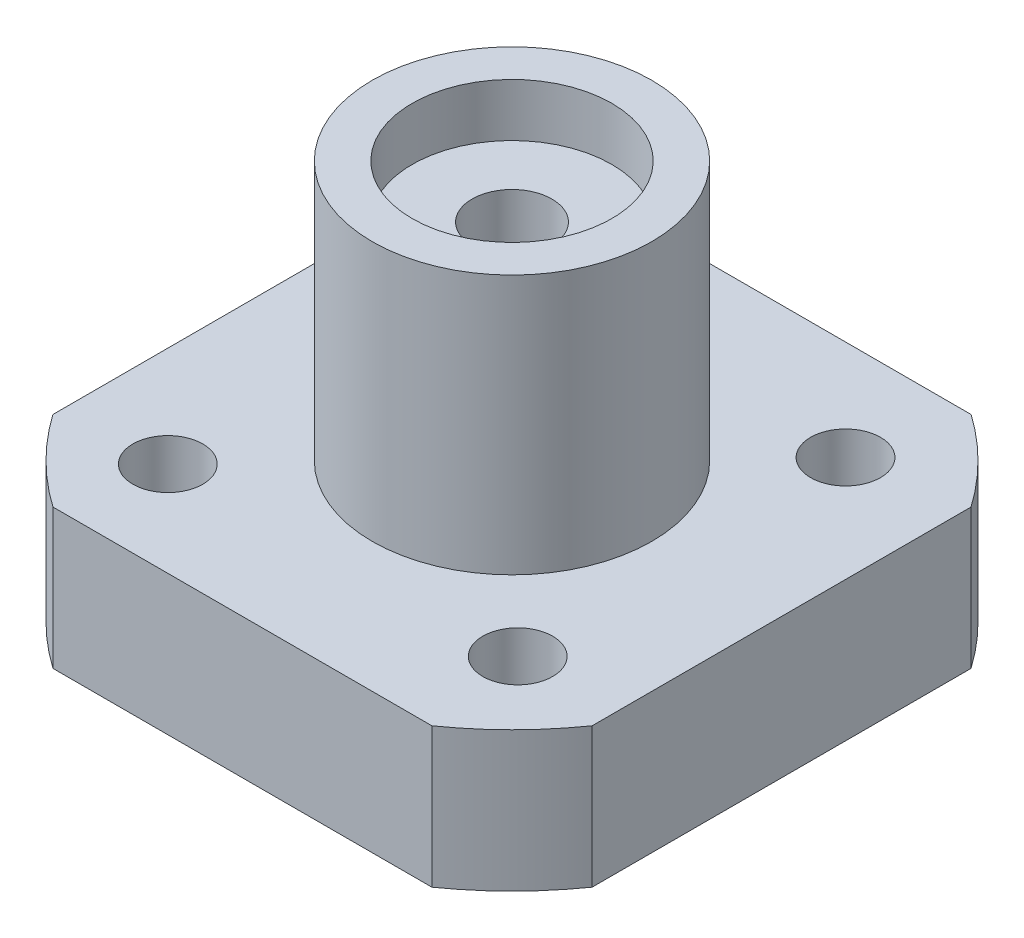
ISO-10303-21;
HEADER;
FILE_DESCRIPTION(('STEP AP214'),'2;1');
FILE_NAME('part.step','',(''),(''),'','','');
FILE_SCHEMA(('AUTOMOTIVE_DESIGN { 1 0 10303 214 1 1 1 1 }'));
ENDSEC;
DATA;
#1=APPLICATION_CONTEXT('core data for automotive mechanical design processes');
#2=APPLICATION_PROTOCOL_DEFINITION('international standard','automotive_design',2000,#1);
#3=PRODUCT_CONTEXT('',#1,'mechanical');
#4=PRODUCT('Part','Part','',(#3));
#5=PRODUCT_RELATED_PRODUCT_CATEGORY('part','',(#4));
#6=PRODUCT_DEFINITION_FORMATION('','',#4);
#7=PRODUCT_DEFINITION_CONTEXT('part definition',#1,'design');
#8=PRODUCT_DEFINITION('design','',#6,#7);
#9=PRODUCT_DEFINITION_SHAPE('','',#8);
#10=(LENGTH_UNIT() NAMED_UNIT(*) SI_UNIT(.MILLI.,.METRE.));
#11=(NAMED_UNIT(*) PLANE_ANGLE_UNIT() SI_UNIT($,.RADIAN.));
#12=(NAMED_UNIT(*) SI_UNIT($,.STERADIAN.) SOLID_ANGLE_UNIT());
#13=UNCERTAINTY_MEASURE_WITH_UNIT(LENGTH_MEASURE(1.E-05),#10,'distance_accuracy_value','');
#14=(GEOMETRIC_REPRESENTATION_CONTEXT(3) GLOBAL_UNCERTAINTY_ASSIGNED_CONTEXT((#13)) GLOBAL_UNIT_ASSIGNED_CONTEXT((#10,
#11,#12)) REPRESENTATION_CONTEXT('',''));
#15=CARTESIAN_POINT('',(0.,0.,0.));
#16=DIRECTION('',(0.,0.,1.));
#17=DIRECTION('',(1.,0.,0.));
#18=AXIS2_PLACEMENT_3D('',#15,#16,#17);
#19=CARTESIAN_POINT('',(0.,-10.,0.));
#20=DIRECTION('',(0.,1.,0.));
#21=DIRECTION('',(0.,0.,1.));
#22=AXIS2_PLACEMENT_3D('',#19,#20,#21);
#23=CYLINDRICAL_SURFACE('',#22,2.);
#24=CARTESIAN_POINT('',(0.,17.35,0.));
#25=DIRECTION('',(0.,1.,0.));
#26=DIRECTION('',(0.,0.,1.));
#27=AXIS2_PLACEMENT_3D('',#24,#25,#26);
#28=CIRCLE('',#27,2.);
#29=CARTESIAN_POINT('',(0.,17.35,2.));
#30=VERTEX_POINT('',#29);
#31=EDGE_CURVE('E168',#30,#30,#28,.F.);
#32=ORIENTED_EDGE('',*,*,#31,.F.);
#33=EDGE_LOOP('',(#32));
#34=FACE_BOUND('',#33,.T.);
#35=CARTESIAN_POINT('',(0.,2.65,0.));
#36=DIRECTION('',(0.,-1.,0.));
#37=DIRECTION('',(0.,0.,-1.));
#38=AXIS2_PLACEMENT_3D('',#35,#36,#37);
#39=CIRCLE('',#38,2.);
#40=CARTESIAN_POINT('',(0.,2.65,-2.));
#41=VERTEX_POINT('',#40);
#42=EDGE_CURVE('E172',#41,#41,#39,.F.);
#43=ORIENTED_EDGE('',*,*,#42,.F.);
#44=EDGE_LOOP('',(#43));
#45=FACE_BOUND('',#44,.T.);
#46=ADVANCED_FACE('F39',(#34,#45),#23,.F.);
#47=CARTESIAN_POINT('',(0.,7.,0.));
#48=DIRECTION('',(0.,-1.,0.));
#49=DIRECTION('',(0.,0.,-1.));
#50=AXIS2_PLACEMENT_3D('',#47,#48,#49);
#51=CYLINDRICAL_SURFACE('',#50,16.5);
#52=CARTESIAN_POINT('',(0.,0.,0.));
#53=DIRECTION('',(0.,1.,0.));
#54=DIRECTION('',(0.,0.,1.));
#55=AXIS2_PLACEMENT_3D('',#52,#53,#54);
#56=CIRCLE('',#55,16.5);
#57=CARTESIAN_POINT('',(13.5,0.,-9.48683298050515));
#58=VERTEX_POINT('',#57);
#59=CARTESIAN_POINT('',(9.48683298050514,0.,-13.5));
#60=VERTEX_POINT('',#59);
#61=EDGE_CURVE('E139',#58,#60,#56,.T.);
#62=ORIENTED_EDGE('',*,*,#61,.T.);
#63=DIRECTION('',(0.,-1.,0.));
#64=VECTOR('',#63,1.);
#65=CARTESIAN_POINT('',(9.48683298050514,7.,-13.5));
#66=LINE('',#65,#64);
#67=CARTESIAN_POINT('',(9.48683298050514,7.,-13.5));
#68=VERTEX_POINT('',#67);
#69=EDGE_CURVE('E49',#68,#60,#66,.T.);
#70=ORIENTED_EDGE('',*,*,#69,.F.);
#71=CARTESIAN_POINT('',(0.,7.,0.));
#72=DIRECTION('',(0.,1.,0.));
#73=DIRECTION('',(0.,0.,1.));
#74=AXIS2_PLACEMENT_3D('',#71,#72,#73);
#75=CIRCLE('',#74,16.5);
#76=CARTESIAN_POINT('',(13.5,7.,-9.48683298050515));
#77=VERTEX_POINT('',#76);
#78=EDGE_CURVE('E154',#77,#68,#75,.T.);
#79=ORIENTED_EDGE('',*,*,#78,.F.);
#80=DIRECTION('',(0.,-1.,0.));
#81=VECTOR('',#80,1.);
#82=CARTESIAN_POINT('',(13.5,7.,-9.48683298050515));
#83=LINE('',#82,#81);
#84=EDGE_CURVE('E135',#77,#58,#83,.T.);
#85=ORIENTED_EDGE('',*,*,#84,.T.);
#86=EDGE_LOOP('',(#62,#70,#79,#85));
#87=FACE_BOUND('',#86,.T.);
#88=ADVANCED_FACE('F41',(#87),#51,.T.);
#89=CARTESIAN_POINT('',(9.48683298050514,7.,-13.5));
#90=DIRECTION('',(0.,0.,1.));
#91=DIRECTION('',(1.,0.,0.));
#92=AXIS2_PLACEMENT_3D('',#89,#90,#91);
#93=PLANE('',#92);
#94=DIRECTION('',(-1.,0.,0.));
#95=VECTOR('',#94,1.);
#96=CARTESIAN_POINT('',(9.48683298050514,0.,-13.5));
#97=LINE('',#96,#95);
#98=CARTESIAN_POINT('',(-9.48683298050514,0.,-13.5));
#99=VERTEX_POINT('',#98);
#100=EDGE_CURVE('E142',#60,#99,#97,.T.);
#101=ORIENTED_EDGE('',*,*,#100,.T.);
#102=DIRECTION('',(0.,-1.,0.));
#103=VECTOR('',#102,1.);
#104=CARTESIAN_POINT('',(-9.48683298050514,7.,-13.5));
#105=LINE('',#104,#103);
#106=CARTESIAN_POINT('',(-9.48683298050514,7.,-13.5));
#107=VERTEX_POINT('',#106);
#108=EDGE_CURVE('E164',#107,#99,#105,.T.);
#109=ORIENTED_EDGE('',*,*,#108,.F.);
#110=DIRECTION('',(-1.,0.,0.));
#111=VECTOR('',#110,1.);
#112=CARTESIAN_POINT('',(9.48683298050514,7.,-13.5));
#113=LINE('',#112,#111);
#114=EDGE_CURVE('E102',#68,#107,#113,.T.);
#115=ORIENTED_EDGE('',*,*,#114,.F.);
#116=ORIENTED_EDGE('',*,*,#69,.T.);
#117=EDGE_LOOP('',(#101,#109,#115,#116));
#118=FACE_BOUND('',#117,.T.);
#119=ADVANCED_FACE('F265',(#118),#93,.F.);
#120=CARTESIAN_POINT('',(0.,7.,0.));
#121=DIRECTION('',(0.,-1.,0.));
#122=DIRECTION('',(0.,0.,-1.));
#123=AXIS2_PLACEMENT_3D('',#120,#121,#122);
#124=CYLINDRICAL_SURFACE('',#123,16.5);
#125=CARTESIAN_POINT('',(0.,0.,0.));
#126=DIRECTION('',(0.,1.,0.));
#127=DIRECTION('',(0.,0.,1.));
#128=AXIS2_PLACEMENT_3D('',#125,#126,#127);
#129=CIRCLE('',#128,16.5);
#130=CARTESIAN_POINT('',(-13.5,0.,-9.48683298050514));
#131=VERTEX_POINT('',#130);
#132=EDGE_CURVE('E145',#99,#131,#129,.T.);
#133=ORIENTED_EDGE('',*,*,#132,.T.);
#134=DIRECTION('',(0.,-1.,0.));
#135=VECTOR('',#134,1.);
#136=CARTESIAN_POINT('',(-13.5,7.,-9.48683298050514));
#137=LINE('',#136,#135);
#138=CARTESIAN_POINT('',(-13.5,7.,-9.48683298050514));
#139=VERTEX_POINT('',#138);
#140=EDGE_CURVE('E161',#139,#131,#137,.T.);
#141=ORIENTED_EDGE('',*,*,#140,.F.);
#142=CARTESIAN_POINT('',(0.,7.,0.));
#143=DIRECTION('',(0.,1.,0.));
#144=DIRECTION('',(0.,0.,1.));
#145=AXIS2_PLACEMENT_3D('',#142,#143,#144);
#146=CIRCLE('',#145,16.5);
#147=EDGE_CURVE('E228',#107,#139,#146,.T.);
#148=ORIENTED_EDGE('',*,*,#147,.F.);
#149=ORIENTED_EDGE('',*,*,#108,.T.);
#150=EDGE_LOOP('',(#133,#141,#148,#149));
#151=FACE_BOUND('',#150,.T.);
#152=ADVANCED_FACE('F557',(#151),#124,.T.);
#153=CARTESIAN_POINT('',(-13.5,7.,9.48683298050514));
#154=DIRECTION('',(1.,0.,0.));
#155=DIRECTION('',(0.,0.,-1.));
#156=AXIS2_PLACEMENT_3D('',#153,#154,#155);
#157=PLANE('',#156);
#158=DIRECTION('',(0.,0.,1.));
#159=VECTOR('',#158,1.);
#160=CARTESIAN_POINT('',(-13.5,0.,9.48683298050514));
#161=LINE('',#160,#159);
#162=CARTESIAN_POINT('',(-13.5,0.,9.48683298050514));
#163=VERTEX_POINT('',#162);
#164=EDGE_CURVE('E147',#131,#163,#161,.T.);
#165=ORIENTED_EDGE('',*,*,#164,.T.);
#166=DIRECTION('',(0.,-1.,0.));
#167=VECTOR('',#166,1.);
#168=CARTESIAN_POINT('',(-13.5,7.,9.48683298050514));
#169=LINE('',#168,#167);
#170=CARTESIAN_POINT('',(-13.5,7.,9.48683298050514));
#171=VERTEX_POINT('',#170);
#172=EDGE_CURVE('E158',#171,#163,#169,.T.);
#173=ORIENTED_EDGE('',*,*,#172,.F.);
#174=DIRECTION('',(0.,0.,1.));
#175=VECTOR('',#174,1.);
#176=CARTESIAN_POINT('',(-13.5,7.,9.48683298050514));
#177=LINE('',#176,#175);
#178=EDGE_CURVE('E230',#139,#171,#177,.T.);
#179=ORIENTED_EDGE('',*,*,#178,.F.);
#180=ORIENTED_EDGE('',*,*,#140,.T.);
#181=EDGE_LOOP('',(#165,#173,#179,#180));
#182=FACE_BOUND('',#181,.T.);
#183=ADVANCED_FACE('F236',(#182),#157,.F.);
#184=CARTESIAN_POINT('',(0.,7.,0.));
#185=DIRECTION('',(0.,-1.,0.));
#186=DIRECTION('',(0.,0.,-1.));
#187=AXIS2_PLACEMENT_3D('',#184,#185,#186);
#188=CYLINDRICAL_SURFACE('',#187,16.5);
#189=CARTESIAN_POINT('',(0.,0.,0.));
#190=DIRECTION('',(0.,1.,0.));
#191=DIRECTION('',(0.,0.,1.));
#192=AXIS2_PLACEMENT_3D('',#189,#190,#191);
#193=CIRCLE('',#192,16.5);
#194=CARTESIAN_POINT('',(-9.48683298050515,0.,13.5));
#195=VERTEX_POINT('',#194);
#196=EDGE_CURVE('E149',#163,#195,#193,.T.);
#197=ORIENTED_EDGE('',*,*,#196,.T.);
#198=DIRECTION('',(0.,-1.,0.));
#199=VECTOR('',#198,1.);
#200=CARTESIAN_POINT('',(-9.48683298050515,7.,13.5));
#201=LINE('',#200,#199);
#202=CARTESIAN_POINT('',(-9.48683298050515,7.,13.5));
#203=VERTEX_POINT('',#202);
#204=EDGE_CURVE('E130',#203,#195,#201,.T.);
#205=ORIENTED_EDGE('',*,*,#204,.F.);
#206=CARTESIAN_POINT('',(0.,7.,0.));
#207=DIRECTION('',(0.,1.,0.));
#208=DIRECTION('',(0.,0.,1.));
#209=AXIS2_PLACEMENT_3D('',#206,#207,#208);
#210=CIRCLE('',#209,16.5);
#211=EDGE_CURVE('E121',#171,#203,#210,.T.);
#212=ORIENTED_EDGE('',*,*,#211,.F.);
#213=ORIENTED_EDGE('',*,*,#172,.T.);
#214=EDGE_LOOP('',(#197,#205,#212,#213));
#215=FACE_BOUND('',#214,.T.);
#216=ADVANCED_FACE('F240',(#215),#188,.T.);
#217=CARTESIAN_POINT('',(9.48683298050515,7.,13.5));
#218=DIRECTION('',(0.,0.,-1.));
#219=DIRECTION('',(-1.,0.,0.));
#220=AXIS2_PLACEMENT_3D('',#217,#218,#219);
#221=PLANE('',#220);
#222=DIRECTION('',(1.,0.,0.));
#223=VECTOR('',#222,1.);
#224=CARTESIAN_POINT('',(9.48683298050515,0.,13.5));
#225=LINE('',#224,#223);
#226=CARTESIAN_POINT('',(9.48683298050515,0.,13.5));
#227=VERTEX_POINT('',#226);
#228=EDGE_CURVE('E129',#195,#227,#225,.T.);
#229=ORIENTED_EDGE('',*,*,#228,.T.);
#230=DIRECTION('',(0.,-1.,0.));
#231=VECTOR('',#230,1.);
#232=CARTESIAN_POINT('',(9.48683298050515,7.,13.5));
#233=LINE('',#232,#231);
#234=CARTESIAN_POINT('',(9.48683298050515,7.,13.5));
#235=VERTEX_POINT('',#234);
#236=EDGE_CURVE('E126',#235,#227,#233,.T.);
#237=ORIENTED_EDGE('',*,*,#236,.F.);
#238=DIRECTION('',(1.,0.,0.));
#239=VECTOR('',#238,1.);
#240=CARTESIAN_POINT('',(9.48683298050515,7.,13.5));
#241=LINE('',#240,#239);
#242=EDGE_CURVE('E115',#203,#235,#241,.T.);
#243=ORIENTED_EDGE('',*,*,#242,.F.);
#244=ORIENTED_EDGE('',*,*,#204,.T.);
#245=EDGE_LOOP('',(#229,#237,#243,#244));
#246=FACE_BOUND('',#245,.T.);
#247=ADVANCED_FACE('F127',(#246),#221,.F.);
#248=CARTESIAN_POINT('',(0.,7.,0.));
#249=DIRECTION('',(0.,-1.,0.));
#250=DIRECTION('',(0.,0.,-1.));
#251=AXIS2_PLACEMENT_3D('',#248,#249,#250);
#252=CYLINDRICAL_SURFACE('',#251,16.5);
#253=CARTESIAN_POINT('',(0.,0.,0.));
#254=DIRECTION('',(0.,1.,0.));
#255=DIRECTION('',(0.,0.,1.));
#256=AXIS2_PLACEMENT_3D('',#253,#254,#255);
#257=CIRCLE('',#256,16.5);
#258=CARTESIAN_POINT('',(13.5,0.,9.48683298050515));
#259=VERTEX_POINT('',#258);
#260=EDGE_CURVE('E87',#227,#259,#257,.T.);
#261=ORIENTED_EDGE('',*,*,#260,.T.);
#262=DIRECTION('',(0.,-1.,0.));
#263=VECTOR('',#262,1.);
#264=CARTESIAN_POINT('',(13.5,7.,9.48683298050515));
#265=LINE('',#264,#263);
#266=CARTESIAN_POINT('',(13.5,7.,9.48683298050515));
#267=VERTEX_POINT('',#266);
#268=EDGE_CURVE('E131',#267,#259,#265,.T.);
#269=ORIENTED_EDGE('',*,*,#268,.F.);
#270=CARTESIAN_POINT('',(0.,7.,0.));
#271=DIRECTION('',(0.,1.,0.));
#272=DIRECTION('',(0.,0.,1.));
#273=AXIS2_PLACEMENT_3D('',#270,#271,#272);
#274=CIRCLE('',#273,16.5);
#275=EDGE_CURVE('E119',#235,#267,#274,.T.);
#276=ORIENTED_EDGE('',*,*,#275,.F.);
#277=ORIENTED_EDGE('',*,*,#236,.T.);
#278=EDGE_LOOP('',(#261,#269,#276,#277));
#279=FACE_BOUND('',#278,.T.);
#280=ADVANCED_FACE('F133',(#279),#252,.T.);
#281=CARTESIAN_POINT('',(13.5,7.,9.48683298050515));
#282=DIRECTION('',(-1.,0.,0.));
#283=DIRECTION('',(0.,0.,1.));
#284=AXIS2_PLACEMENT_3D('',#281,#282,#283);
#285=PLANE('',#284);
#286=DIRECTION('',(0.,0.,-1.));
#287=VECTOR('',#286,1.);
#288=CARTESIAN_POINT('',(13.5,0.,9.48683298050515));
#289=LINE('',#288,#287);
#290=EDGE_CURVE('E93',#259,#58,#289,.T.);
#291=ORIENTED_EDGE('',*,*,#290,.T.);
#292=ORIENTED_EDGE('',*,*,#84,.F.);
#293=DIRECTION('',(0.,0.,-1.));
#294=VECTOR('',#293,1.);
#295=CARTESIAN_POINT('',(13.5,7.,9.48683298050515));
#296=LINE('',#295,#294);
#297=EDGE_CURVE('E58',#267,#77,#296,.T.);
#298=ORIENTED_EDGE('',*,*,#297,.F.);
#299=ORIENTED_EDGE('',*,*,#268,.T.);
#300=EDGE_LOOP('',(#291,#292,#298,#299));
#301=FACE_BOUND('',#300,.T.);
#302=ADVANCED_FACE('F248',(#301),#285,.F.);
#303=CARTESIAN_POINT('',(0.,7.,0.));
#304=DIRECTION('',(0.,1.,0.));
#305=DIRECTION('',(0.,0.,1.));
#306=AXIS2_PLACEMENT_3D('',#303,#304,#305);
#307=PLANE('',#306);
#308=CARTESIAN_POINT('',(8.20985245385894,7.,-8.49206613193443));
#309=DIRECTION('',(0.,1.,0.));
#310=DIRECTION('',(0.,0.,1.));
#311=AXIS2_PLACEMENT_3D('',#308,#309,#310);
#312=CIRCLE('',#311,1.75);
#313=CARTESIAN_POINT('',(8.20985245385894,7.,-6.74206613193443));
#314=VERTEX_POINT('',#313);
#315=EDGE_CURVE('E43',#314,#314,#312,.T.);
#316=ORIENTED_EDGE('',*,*,#315,.F.);
#317=EDGE_LOOP('',(#316));
#318=FACE_BOUND('',#317,.T.);
#319=CARTESIAN_POINT('',(-8.62636440429542,7.,-8.33968764161225));
#320=DIRECTION('',(0.,1.,0.));
#321=DIRECTION('',(0.,0.,1.));
#322=AXIS2_PLACEMENT_3D('',#319,#320,#321);
#323=CIRCLE('',#322,1.75);
#324=CARTESIAN_POINT('',(-8.62636440429542,7.,-6.58968764161225));
#325=VERTEX_POINT('',#324);
#326=EDGE_CURVE('E186',#325,#325,#323,.T.);
#327=ORIENTED_EDGE('',*,*,#326,.F.);
#328=EDGE_LOOP('',(#327));
#329=FACE_BOUND('',#328,.T.);
#330=CARTESIAN_POINT('',(-8.47157611550069,7.,8.76278654449698));
#331=DIRECTION('',(0.,1.,0.));
#332=DIRECTION('',(0.,0.,1.));
#333=AXIS2_PLACEMENT_3D('',#330,#331,#332);
#334=CIRCLE('',#333,1.75);
#335=CARTESIAN_POINT('',(-8.47157611550069,7.,10.512786544497));
#336=VERTEX_POINT('',#335);
#337=EDGE_CURVE('E182',#336,#336,#334,.T.);
#338=ORIENTED_EDGE('',*,*,#337,.F.);
#339=EDGE_LOOP('',(#338));
#340=FACE_BOUND('',#339,.T.);
#341=CARTESIAN_POINT('',(8.62636440431887,7.,8.33968764164019));
#342=DIRECTION('',(0.,1.,0.));
#343=DIRECTION('',(0.,0.,1.));
#344=AXIS2_PLACEMENT_3D('',#341,#342,#343);
#345=CIRCLE('',#344,1.75);
#346=CARTESIAN_POINT('',(8.62636440431887,7.,10.0896876416402));
#347=VERTEX_POINT('',#346);
#348=EDGE_CURVE('E177',#347,#347,#345,.T.);
#349=ORIENTED_EDGE('',*,*,#348,.F.);
#350=EDGE_LOOP('',(#349));
#351=FACE_BOUND('',#350,.T.);
#352=CARTESIAN_POINT('',(0.,7.,0.));
#353=DIRECTION('',(0.,1.,0.));
#354=DIRECTION('',(0.,0.,1.));
#355=AXIS2_PLACEMENT_3D('',#352,#353,#354);
#356=CIRCLE('',#355,7.);
#357=CARTESIAN_POINT('',(0.,7.,-7.));
#358=VERTEX_POINT('',#357);
#359=EDGE_CURVE('E11',#358,#358,#356,.T.);
#360=ORIENTED_EDGE('',*,*,#359,.F.);
#361=EDGE_LOOP('',(#360));
#362=FACE_BOUND('',#361,.T.);
#363=ORIENTED_EDGE('',*,*,#78,.T.);
#364=ORIENTED_EDGE('',*,*,#114,.T.);
#365=ORIENTED_EDGE('',*,*,#147,.T.);
#366=ORIENTED_EDGE('',*,*,#178,.T.);
#367=ORIENTED_EDGE('',*,*,#211,.T.);
#368=ORIENTED_EDGE('',*,*,#242,.T.);
#369=ORIENTED_EDGE('',*,*,#275,.T.);
#370=ORIENTED_EDGE('',*,*,#297,.T.);
#371=EDGE_LOOP('',(#363,#364,#365,#366,#367,#368,#369,#370));
#372=FACE_BOUND('',#371,.T.);
#373=ADVANCED_FACE('F117',(#318,#329,#340,#351,#362,#372),#307,.T.);
#374=CARTESIAN_POINT('',(0.,0.,0.));
#375=DIRECTION('',(0.,1.,0.));
#376=DIRECTION('',(0.,0.,1.));
#377=AXIS2_PLACEMENT_3D('',#374,#375,#376);
#378=PLANE('',#377);
#379=CARTESIAN_POINT('',(8.20985245385894,0.,-8.49206613193443));
#380=DIRECTION('',(0.,-1.,0.));
#381=DIRECTION('',(0.,0.,-1.));
#382=AXIS2_PLACEMENT_3D('',#379,#380,#381);
#383=CIRCLE('',#382,3.25);
#384=CARTESIAN_POINT('',(8.20985245385894,0.,-11.7420661319344));
#385=VERTEX_POINT('',#384);
#386=EDGE_CURVE('E287',#385,#385,#383,.T.);
#387=ORIENTED_EDGE('',*,*,#386,.F.);
#388=EDGE_LOOP('',(#387));
#389=FACE_BOUND('',#388,.T.);
#390=CARTESIAN_POINT('',(-8.62636440429542,0.,-8.33968764161225));
#391=DIRECTION('',(0.,-1.,0.));
#392=DIRECTION('',(0.,0.,-1.));
#393=AXIS2_PLACEMENT_3D('',#390,#391,#392);
#394=CIRCLE('',#393,3.25);
#395=CARTESIAN_POINT('',(-8.62636440429542,0.,-11.5896876416123));
#396=VERTEX_POINT('',#395);
#397=EDGE_CURVE('E201',#396,#396,#394,.T.);
#398=ORIENTED_EDGE('',*,*,#397,.F.);
#399=EDGE_LOOP('',(#398));
#400=FACE_BOUND('',#399,.T.);
#401=CARTESIAN_POINT('',(-8.47157611550069,0.,8.76278654449698));
#402=DIRECTION('',(0.,-1.,0.));
#403=DIRECTION('',(0.,0.,-1.));
#404=AXIS2_PLACEMENT_3D('',#401,#402,#403);
#405=CIRCLE('',#404,3.25);
#406=CARTESIAN_POINT('',(-8.47157611550069,0.,5.51278654449698));
#407=VERTEX_POINT('',#406);
#408=EDGE_CURVE('E188',#407,#407,#405,.T.);
#409=ORIENTED_EDGE('',*,*,#408,.F.);
#410=EDGE_LOOP('',(#409));
#411=FACE_BOUND('',#410,.T.);
#412=CARTESIAN_POINT('',(8.62636440431887,0.,8.33968764164019));
#413=DIRECTION('',(0.,-1.,0.));
#414=DIRECTION('',(0.,0.,-1.));
#415=AXIS2_PLACEMENT_3D('',#412,#413,#414);
#416=CIRCLE('',#415,3.25);
#417=CARTESIAN_POINT('',(8.62636440431887,0.,5.08968764164019));
#418=VERTEX_POINT('',#417);
#419=EDGE_CURVE('E184',#418,#418,#416,.T.);
#420=ORIENTED_EDGE('',*,*,#419,.F.);
#421=EDGE_LOOP('',(#420));
#422=FACE_BOUND('',#421,.T.);
#423=CARTESIAN_POINT('',(0.,0.,0.));
#424=DIRECTION('',(0.,-1.,0.));
#425=DIRECTION('',(0.,0.,-1.));
#426=AXIS2_PLACEMENT_3D('',#423,#424,#425);
#427=CIRCLE('',#426,5.);
#428=CARTESIAN_POINT('',(0.,0.,-5.));
#429=VERTEX_POINT('',#428);
#430=EDGE_CURVE('E180',#429,#429,#427,.T.);
#431=ORIENTED_EDGE('',*,*,#430,.F.);
#432=EDGE_LOOP('',(#431));
#433=FACE_BOUND('',#432,.T.);
#434=ORIENTED_EDGE('',*,*,#61,.F.);
#435=ORIENTED_EDGE('',*,*,#290,.F.);
#436=ORIENTED_EDGE('',*,*,#260,.F.);
#437=ORIENTED_EDGE('',*,*,#228,.F.);
#438=ORIENTED_EDGE('',*,*,#196,.F.);
#439=ORIENTED_EDGE('',*,*,#164,.F.);
#440=ORIENTED_EDGE('',*,*,#132,.F.);
#441=ORIENTED_EDGE('',*,*,#100,.F.);
#442=EDGE_LOOP('',(#434,#435,#436,#437,#438,#439,#440,#441));
#443=FACE_BOUND('',#442,.T.);
#444=ADVANCED_FACE('F243',(#389,#400,#411,#422,#433,#443),#378,.F.);
#445=CARTESIAN_POINT('',(0.,20.,0.));
#446=DIRECTION('',(0.,-1.,0.));
#447=DIRECTION('',(0.,0.,-1.));
#448=AXIS2_PLACEMENT_3D('',#445,#446,#447);
#449=CYLINDRICAL_SURFACE('',#448,7.);
#450=CARTESIAN_POINT('',(0.,20.,0.));
#451=DIRECTION('',(0.,1.,0.));
#452=DIRECTION('',(0.,0.,1.));
#453=AXIS2_PLACEMENT_3D('',#450,#451,#452);
#454=CIRCLE('',#453,7.);
#455=CARTESIAN_POINT('',(0.,20.,-7.));
#456=VERTEX_POINT('',#455);
#457=EDGE_CURVE('E143',#456,#456,#454,.T.);
#458=CARTESIAN_POINT('',(0.,20.,-7.));
#459=CARTESIAN_POINT('',(0.,19.8645833333333,-7.));
#460=CARTESIAN_POINT('',(0.,19.7291666666667,-7.));
#461=CARTESIAN_POINT('',(0.,19.4583333333333,-7.));
#462=CARTESIAN_POINT('',(0.,19.3229166666667,-7.));
#463=CARTESIAN_POINT('',(0.,19.0520833333333,-7.));
#464=CARTESIAN_POINT('',(0.,18.9166666666667,-7.));
#465=CARTESIAN_POINT('',(0.,18.6458333333333,-7.));
#466=CARTESIAN_POINT('',(0.,18.5104166666667,-7.));
#467=CARTESIAN_POINT('',(0.,18.2395833333333,-7.));
#468=CARTESIAN_POINT('',(0.,18.1041666666667,-7.));
#469=CARTESIAN_POINT('',(0.,17.8333333333333,-7.));
#470=CARTESIAN_POINT('',(0.,17.6979166666667,-7.));
#471=CARTESIAN_POINT('',(0.,17.4270833333333,-7.));
#472=CARTESIAN_POINT('',(0.,17.2916666666667,-7.));
#473=CARTESIAN_POINT('',(0.,17.0208333333333,-7.));
#474=CARTESIAN_POINT('',(0.,16.8854166666667,-7.));
#475=CARTESIAN_POINT('',(0.,16.6145833333333,-7.));
#476=CARTESIAN_POINT('',(0.,16.4791666666667,-7.));
#477=CARTESIAN_POINT('',(0.,16.2083333333333,-7.));
#478=CARTESIAN_POINT('',(0.,16.0729166666667,-7.));
#479=CARTESIAN_POINT('',(0.,15.8020833333333,-7.));
#480=CARTESIAN_POINT('',(0.,15.6666666666667,-7.));
#481=CARTESIAN_POINT('',(0.,15.3958333333333,-7.));
#482=CARTESIAN_POINT('',(0.,15.2604166666667,-7.));
#483=CARTESIAN_POINT('',(0.,14.9895833333333,-7.));
#484=CARTESIAN_POINT('',(0.,14.8541666666667,-7.));
#485=CARTESIAN_POINT('',(0.,14.5833333333333,-7.));
#486=CARTESIAN_POINT('',(0.,14.4479166666667,-7.));
#487=CARTESIAN_POINT('',(0.,14.1770833333333,-7.));
#488=CARTESIAN_POINT('',(0.,14.0416666666667,-7.));
#489=CARTESIAN_POINT('',(0.,13.7708333333333,-7.));
#490=CARTESIAN_POINT('',(0.,13.6354166666667,-7.));
#491=CARTESIAN_POINT('',(0.,13.3645833333333,-7.));
#492=CARTESIAN_POINT('',(0.,13.2291666666667,-7.));
#493=CARTESIAN_POINT('',(0.,12.9583333333333,-7.));
#494=CARTESIAN_POINT('',(0.,12.8229166666667,-7.));
#495=CARTESIAN_POINT('',(0.,12.5520833333333,-7.));
#496=CARTESIAN_POINT('',(0.,12.4166666666667,-7.));
#497=CARTESIAN_POINT('',(0.,12.1458333333333,-7.));
#498=CARTESIAN_POINT('',(0.,12.0104166666667,-7.));
#499=CARTESIAN_POINT('',(0.,11.7395833333333,-7.));
#500=CARTESIAN_POINT('',(0.,11.6041666666667,-7.));
#501=CARTESIAN_POINT('',(0.,11.3333333333333,-7.));
#502=CARTESIAN_POINT('',(0.,11.1979166666667,-7.));
#503=CARTESIAN_POINT('',(0.,10.9270833333333,-7.));
#504=CARTESIAN_POINT('',(0.,10.7916666666667,-7.));
#505=CARTESIAN_POINT('',(0.,10.5208333333333,-7.));
#506=CARTESIAN_POINT('',(0.,10.3854166666667,-7.));
#507=CARTESIAN_POINT('',(0.,10.1145833333333,-7.));
#508=CARTESIAN_POINT('',(0.,9.97916666666667,-7.));
#509=CARTESIAN_POINT('',(0.,9.70833333333333,-7.));
#510=CARTESIAN_POINT('',(0.,9.57291666666667,-7.));
#511=CARTESIAN_POINT('',(0.,9.30208333333333,-7.));
#512=CARTESIAN_POINT('',(0.,9.16666666666667,-7.));
#513=CARTESIAN_POINT('',(0.,8.89583333333333,-7.));
#514=CARTESIAN_POINT('',(0.,8.76041666666667,-7.));
#515=CARTESIAN_POINT('',(0.,8.48958333333333,-7.));
#516=CARTESIAN_POINT('',(0.,8.35416666666667,-7.));
#517=CARTESIAN_POINT('',(0.,8.08333333333333,-7.));
#518=CARTESIAN_POINT('',(0.,7.94791666666667,-7.));
#519=CARTESIAN_POINT('',(0.,7.67708333333333,-7.));
#520=CARTESIAN_POINT('',(0.,7.54166666666667,-7.));
#521=CARTESIAN_POINT('',(0.,7.27083333333333,-7.));
#522=CARTESIAN_POINT('',(0.,7.13541666666667,-7.));
#523=CARTESIAN_POINT('',(0.,7.,-7.));
#524=B_SPLINE_CURVE_WITH_KNOTS('',3,(#458,#459,#460,#461,#462,#463,#464,#465,#466,#467,#468,
#469,#470,#471,#472,#473,#474,#475,#476,#477,#478,#479,#480,#481,#482,#483,#484,#485,#486,#487,
#488,#489,#490,#491,#492,#493,#494,#495,#496,#497,#498,#499,#500,#501,#502,#503,#504,#505,#506,
#507,#508,#509,#510,#511,#512,#513,#514,#515,#516,#517,#518,#519,#520,#521,#522,#523),
.UNSPECIFIED.,.F.,.F.,(4,2,2,2,2,2,2,2,2,2,2,2,2,2,2,2,2,2,2,2,2,2,2,2,2,2,2,2,2,2,2,2,4),(0.,
0.40625,0.812500000000001,1.21875,1.625,2.03125,2.4375,2.84375,3.25,3.65625,4.0625,4.46875,
4.875,5.28125,5.6875,6.09375,6.5,6.90625,7.3125,7.71875,8.125,8.53125,8.9375,9.34375,9.75,
10.15625,10.5625,10.96875,11.375,11.78125,12.1875,12.59375,13.),.UNSPECIFIED.);
#525=EDGE_CURVE('BSEAM276',#456,#358,#524,.T.);
#526=ORIENTED_EDGE('',*,*,#457,.F.);
#527=ORIENTED_EDGE('',*,*,#359,.T.);
#528=ORIENTED_EDGE('',*,*,#525,.T.);
#529=ORIENTED_EDGE('',*,*,#525,.F.);
#530=EDGE_LOOP('',(#526,#528,#527,#529));
#531=FACE_BOUND('',#530,.T.);
#532=ADVANCED_FACE('F276',(#531),#449,.T.);
#533=CARTESIAN_POINT('',(0.,20.,0.));
#534=DIRECTION('',(0.,1.,0.));
#535=DIRECTION('',(0.,0.,1.));
#536=AXIS2_PLACEMENT_3D('',#533,#534,#535);
#537=PLANE('',#536);
#538=CARTESIAN_POINT('',(0.,20.,0.));
#539=DIRECTION('',(0.,1.,0.));
#540=DIRECTION('',(0.,0.,1.));
#541=AXIS2_PLACEMENT_3D('',#538,#539,#540);
#542=CIRCLE('',#541,5.);
#543=CARTESIAN_POINT('',(0.,20.,5.));
#544=VERTEX_POINT('',#543);
#545=EDGE_CURVE('E175',#544,#544,#542,.T.);
#546=ORIENTED_EDGE('',*,*,#545,.F.);
#547=EDGE_LOOP('',(#546));
#548=FACE_BOUND('',#547,.T.);
#549=ORIENTED_EDGE('',*,*,#457,.T.);
#550=EDGE_LOOP('',(#549));
#551=FACE_BOUND('',#550,.T.);
#552=ADVANCED_FACE('F272',(#548,#551),#537,.T.);
#553=CARTESIAN_POINT('',(0.,17.35,0.));
#554=DIRECTION('',(0.,1.,0.));
#555=DIRECTION('',(0.,0.,1.));
#556=AXIS2_PLACEMENT_3D('',#553,#554,#555);
#557=PLANE('',#556);
#558=CARTESIAN_POINT('',(0.,17.35,0.));
#559=DIRECTION('',(0.,1.,0.));
#560=DIRECTION('',(0.,0.,1.));
#561=AXIS2_PLACEMENT_3D('',#558,#559,#560);
#562=CIRCLE('',#561,5.);
#563=CARTESIAN_POINT('',(0.,17.35,5.));
#564=VERTEX_POINT('',#563);
#565=EDGE_CURVE('E171',#564,#564,#562,.T.);
#566=ORIENTED_EDGE('',*,*,#565,.T.);
#567=EDGE_LOOP('',(#566));
#568=FACE_BOUND('',#567,.T.);
#569=ORIENTED_EDGE('',*,*,#31,.T.);
#570=EDGE_LOOP('',(#569));
#571=FACE_BOUND('',#570,.T.);
#572=ADVANCED_FACE('F275',(#568,#571),#557,.T.);
#573=CARTESIAN_POINT('',(0.,17.35,0.));
#574=DIRECTION('',(0.,1.,0.));
#575=DIRECTION('',(0.,0.,1.));
#576=AXIS2_PLACEMENT_3D('',#573,#574,#575);
#577=CYLINDRICAL_SURFACE('',#576,5.);
#578=ORIENTED_EDGE('',*,*,#565,.F.);
#579=EDGE_LOOP('',(#578));
#580=FACE_BOUND('',#579,.T.);
#581=ORIENTED_EDGE('',*,*,#545,.T.);
#582=EDGE_LOOP('',(#581));
#583=FACE_BOUND('',#582,.T.);
#584=ADVANCED_FACE('F270',(#580,#583),#577,.F.);
#585=CARTESIAN_POINT('',(0.,2.65,0.));
#586=DIRECTION('',(0.,-1.,0.));
#587=DIRECTION('',(0.,0.,-1.));
#588=AXIS2_PLACEMENT_3D('',#585,#586,#587);
#589=PLANE('',#588);
#590=CARTESIAN_POINT('',(0.,2.65,0.));
#591=DIRECTION('',(0.,-1.,0.));
#592=DIRECTION('',(0.,0.,-1.));
#593=AXIS2_PLACEMENT_3D('',#590,#591,#592);
#594=CIRCLE('',#593,5.);
#595=CARTESIAN_POINT('',(0.,2.65,-5.));
#596=VERTEX_POINT('',#595);
#597=EDGE_CURVE('E176',#596,#596,#594,.T.);
#598=ORIENTED_EDGE('',*,*,#597,.T.);
#599=EDGE_LOOP('',(#598));
#600=FACE_BOUND('',#599,.T.);
#601=ORIENTED_EDGE('',*,*,#42,.T.);
#602=EDGE_LOOP('',(#601));
#603=FACE_BOUND('',#602,.T.);
#604=ADVANCED_FACE('F300',(#600,#603),#589,.T.);
#605=CARTESIAN_POINT('',(0.,2.65,0.));
#606=DIRECTION('',(0.,-1.,0.));
#607=DIRECTION('',(0.,0.,-1.));
#608=AXIS2_PLACEMENT_3D('',#605,#606,#607);
#609=CYLINDRICAL_SURFACE('',#608,5.);
#610=ORIENTED_EDGE('',*,*,#597,.F.);
#611=EDGE_LOOP('',(#610));
#612=FACE_BOUND('',#611,.T.);
#613=ORIENTED_EDGE('',*,*,#430,.T.);
#614=EDGE_LOOP('',(#613));
#615=FACE_BOUND('',#614,.T.);
#616=ADVANCED_FACE('F297',(#612,#615),#609,.F.);
#617=CARTESIAN_POINT('',(8.62636440431887,0.,8.33968764164019));
#618=DIRECTION('',(0.,-1.,0.));
#619=DIRECTION('',(0.,0.,-1.));
#620=AXIS2_PLACEMENT_3D('',#617,#618,#619);
#621=CYLINDRICAL_SURFACE('',#620,1.75);
#622=ORIENTED_EDGE('',*,*,#348,.T.);
#623=EDGE_LOOP('',(#622));
#624=FACE_BOUND('',#623,.T.);
#625=CARTESIAN_POINT('',(8.62636440431887,3.1,8.33968764164019));
#626=DIRECTION('',(0.,-1.,0.));
#627=DIRECTION('',(0.,0.,-1.));
#628=AXIS2_PLACEMENT_3D('',#625,#626,#627);
#629=CIRCLE('',#628,1.75);
#630=CARTESIAN_POINT('',(8.62636440431887,3.1,6.58968764164019));
#631=VERTEX_POINT('',#630);
#632=EDGE_CURVE('E181',#631,#631,#629,.T.);
#633=ORIENTED_EDGE('',*,*,#632,.T.);
#634=EDGE_LOOP('',(#633));
#635=FACE_BOUND('',#634,.T.);
#636=ADVANCED_FACE('F299',(#624,#635),#621,.F.);
#637=CARTESIAN_POINT('',(10.3763644043189,3.1,8.33968764164019));
#638=DIRECTION('',(0.,1.,0.));
#639=DIRECTION('',(0.,0.,1.));
#640=AXIS2_PLACEMENT_3D('',#637,#638,#639);
#641=PLANE('',#640);
#642=ORIENTED_EDGE('',*,*,#632,.F.);
#643=EDGE_LOOP('',(#642));
#644=FACE_BOUND('',#643,.T.);
#645=CARTESIAN_POINT('',(8.62636440431887,3.1,8.33968764164019));
#646=DIRECTION('',(0.,-1.,0.));
#647=DIRECTION('',(0.,0.,-1.));
#648=AXIS2_PLACEMENT_3D('',#645,#646,#647);
#649=CIRCLE('',#648,3.25);
#650=CARTESIAN_POINT('',(8.62636440431887,3.1,5.08968764164019));
#651=VERTEX_POINT('',#650);
#652=EDGE_CURVE('E211',#651,#651,#649,.T.);
#653=ORIENTED_EDGE('',*,*,#652,.T.);
#654=EDGE_LOOP('',(#653));
#655=FACE_BOUND('',#654,.T.);
#656=ADVANCED_FACE('F307',(#644,#655),#641,.F.);
#657=CARTESIAN_POINT('',(8.62636440431887,0.,8.33968764164019));
#658=DIRECTION('',(0.,-1.,0.));
#659=DIRECTION('',(0.,0.,-1.));
#660=AXIS2_PLACEMENT_3D('',#657,#658,#659);
#661=CYLINDRICAL_SURFACE('',#660,3.25);
#662=ORIENTED_EDGE('',*,*,#652,.F.);
#663=EDGE_LOOP('',(#662));
#664=FACE_BOUND('',#663,.T.);
#665=ORIENTED_EDGE('',*,*,#419,.T.);
#666=EDGE_LOOP('',(#665));
#667=FACE_BOUND('',#666,.T.);
#668=ADVANCED_FACE('F372',(#664,#667),#661,.F.);
#669=CARTESIAN_POINT('',(-8.47157611550069,0.,8.76278654449698));
#670=DIRECTION('',(0.,-1.,0.));
#671=DIRECTION('',(0.,0.,-1.));
#672=AXIS2_PLACEMENT_3D('',#669,#670,#671);
#673=CYLINDRICAL_SURFACE('',#672,1.75);
#674=ORIENTED_EDGE('',*,*,#337,.T.);
#675=EDGE_LOOP('',(#674));
#676=FACE_BOUND('',#675,.T.);
#677=CARTESIAN_POINT('',(-8.47157611550069,3.1,8.76278654449698));
#678=DIRECTION('',(0.,-1.,0.));
#679=DIRECTION('',(0.,0.,-1.));
#680=AXIS2_PLACEMENT_3D('',#677,#678,#679);
#681=CIRCLE('',#680,1.75);
#682=CARTESIAN_POINT('',(-8.47157611550069,3.1,7.01278654449698));
#683=VERTEX_POINT('',#682);
#684=EDGE_CURVE('E185',#683,#683,#681,.T.);
#685=ORIENTED_EDGE('',*,*,#684,.T.);
#686=EDGE_LOOP('',(#685));
#687=FACE_BOUND('',#686,.T.);
#688=ADVANCED_FACE('F383',(#676,#687),#673,.F.);
#689=CARTESIAN_POINT('',(-6.72157611550069,3.1,8.76278654449698));
#690=DIRECTION('',(0.,1.,0.));
#691=DIRECTION('',(0.,0.,1.));
#692=AXIS2_PLACEMENT_3D('',#689,#690,#691);
#693=PLANE('',#692);
#694=ORIENTED_EDGE('',*,*,#684,.F.);
#695=EDGE_LOOP('',(#694));
#696=FACE_BOUND('',#695,.T.);
#697=CARTESIAN_POINT('',(-8.47157611550069,3.1,8.76278654449698));
#698=DIRECTION('',(0.,-1.,0.));
#699=DIRECTION('',(0.,0.,-1.));
#700=AXIS2_PLACEMENT_3D('',#697,#698,#699);
#701=CIRCLE('',#700,3.25);
#702=CARTESIAN_POINT('',(-8.47157611550069,3.1,5.51278654449698));
#703=VERTEX_POINT('',#702);
#704=EDGE_CURVE('E193',#703,#703,#701,.T.);
#705=ORIENTED_EDGE('',*,*,#704,.T.);
#706=EDGE_LOOP('',(#705));
#707=FACE_BOUND('',#706,.T.);
#708=ADVANCED_FACE('F394',(#696,#707),#693,.F.);
#709=CARTESIAN_POINT('',(-8.47157611550069,0.,8.76278654449698));
#710=DIRECTION('',(0.,-1.,0.));
#711=DIRECTION('',(0.,0.,-1.));
#712=AXIS2_PLACEMENT_3D('',#709,#710,#711);
#713=CYLINDRICAL_SURFACE('',#712,3.25);
#714=ORIENTED_EDGE('',*,*,#704,.F.);
#715=EDGE_LOOP('',(#714));
#716=FACE_BOUND('',#715,.T.);
#717=ORIENTED_EDGE('',*,*,#408,.T.);
#718=EDGE_LOOP('',(#717));
#719=FACE_BOUND('',#718,.T.);
#720=ADVANCED_FACE('F405',(#716,#719),#713,.F.);
#721=CARTESIAN_POINT('',(-8.62636440429542,0.,-8.33968764161225));
#722=DIRECTION('',(0.,-1.,0.));
#723=DIRECTION('',(0.,0.,-1.));
#724=AXIS2_PLACEMENT_3D('',#721,#722,#723);
#725=CYLINDRICAL_SURFACE('',#724,1.75);
#726=ORIENTED_EDGE('',*,*,#326,.T.);
#727=EDGE_LOOP('',(#726));
#728=FACE_BOUND('',#727,.T.);
#729=CARTESIAN_POINT('',(-8.62636440429542,3.1,-8.33968764161225));
#730=DIRECTION('',(0.,-1.,0.));
#731=DIRECTION('',(0.,0.,-1.));
#732=AXIS2_PLACEMENT_3D('',#729,#730,#731);
#733=CIRCLE('',#732,1.75);
#734=CARTESIAN_POINT('',(-8.62636440429542,3.1,-10.0896876416123));
#735=VERTEX_POINT('',#734);
#736=EDGE_CURVE('E189',#735,#735,#733,.T.);
#737=ORIENTED_EDGE('',*,*,#736,.T.);
#738=EDGE_LOOP('',(#737));
#739=FACE_BOUND('',#738,.T.);
#740=ADVANCED_FACE('F416',(#728,#739),#725,.F.);
#741=CARTESIAN_POINT('',(-6.87636440429542,3.1,-8.33968764161225));
#742=DIRECTION('',(0.,1.,0.));
#743=DIRECTION('',(0.,0.,1.));
#744=AXIS2_PLACEMENT_3D('',#741,#742,#743);
#745=PLANE('',#744);
#746=ORIENTED_EDGE('',*,*,#736,.F.);
#747=EDGE_LOOP('',(#746));
#748=FACE_BOUND('',#747,.T.);
#749=CARTESIAN_POINT('',(-8.62636440429542,3.1,-8.33968764161225));
#750=DIRECTION('',(0.,-1.,0.));
#751=DIRECTION('',(0.,0.,-1.));
#752=AXIS2_PLACEMENT_3D('',#749,#750,#751);
#753=CIRCLE('',#752,3.25);
#754=CARTESIAN_POINT('',(-8.62636440429542,3.1,-11.5896876416123));
#755=VERTEX_POINT('',#754);
#756=EDGE_CURVE('E196',#755,#755,#753,.T.);
#757=ORIENTED_EDGE('',*,*,#756,.T.);
#758=EDGE_LOOP('',(#757));
#759=FACE_BOUND('',#758,.T.);
#760=ADVANCED_FACE('F427',(#748,#759),#745,.F.);
#761=CARTESIAN_POINT('',(-8.62636440429542,0.,-8.33968764161225));
#762=DIRECTION('',(0.,-1.,0.));
#763=DIRECTION('',(0.,0.,-1.));
#764=AXIS2_PLACEMENT_3D('',#761,#762,#763);
#765=CYLINDRICAL_SURFACE('',#764,3.25);
#766=ORIENTED_EDGE('',*,*,#756,.F.);
#767=EDGE_LOOP('',(#766));
#768=FACE_BOUND('',#767,.T.);
#769=ORIENTED_EDGE('',*,*,#397,.T.);
#770=EDGE_LOOP('',(#769));
#771=FACE_BOUND('',#770,.T.);
#772=ADVANCED_FACE('F437',(#768,#771),#765,.F.);
#773=CARTESIAN_POINT('',(8.20985245385894,0.,-8.49206613193443));
#774=DIRECTION('',(0.,-1.,0.));
#775=DIRECTION('',(0.,0.,-1.));
#776=AXIS2_PLACEMENT_3D('',#773,#774,#775);
#777=CYLINDRICAL_SURFACE('',#776,1.75);
#778=ORIENTED_EDGE('',*,*,#315,.T.);
#779=EDGE_LOOP('',(#778));
#780=FACE_BOUND('',#779,.T.);
#781=CARTESIAN_POINT('',(8.20985245385894,3.1,-8.49206613193443));
#782=DIRECTION('',(0.,-1.,0.));
#783=DIRECTION('',(0.,0.,-1.));
#784=AXIS2_PLACEMENT_3D('',#781,#782,#783);
#785=CIRCLE('',#784,1.75);
#786=CARTESIAN_POINT('',(8.20985245385894,3.1,-10.2420661319344));
#787=VERTEX_POINT('',#786);
#788=EDGE_CURVE('E608',#787,#787,#785,.T.);
#789=ORIENTED_EDGE('',*,*,#788,.T.);
#790=EDGE_LOOP('',(#789));
#791=FACE_BOUND('',#790,.T.);
#792=ADVANCED_FACE('F448',(#780,#791),#777,.F.);
#793=CARTESIAN_POINT('',(9.95985245385894,3.1,-8.49206613193443));
#794=DIRECTION('',(0.,1.,0.));
#795=DIRECTION('',(0.,0.,1.));
#796=AXIS2_PLACEMENT_3D('',#793,#794,#795);
#797=PLANE('',#796);
#798=ORIENTED_EDGE('',*,*,#788,.F.);
#799=EDGE_LOOP('',(#798));
#800=FACE_BOUND('',#799,.T.);
#801=CARTESIAN_POINT('',(8.20985245385894,3.1,-8.49206613193443));
#802=DIRECTION('',(0.,-1.,0.));
#803=DIRECTION('',(0.,0.,-1.));
#804=AXIS2_PLACEMENT_3D('',#801,#802,#803);
#805=CIRCLE('',#804,3.25);
#806=CARTESIAN_POINT('',(8.20985245385894,3.1,-11.7420661319344));
#807=VERTEX_POINT('',#806);
#808=EDGE_CURVE('E606',#807,#807,#805,.T.);
#809=ORIENTED_EDGE('',*,*,#808,.T.);
#810=EDGE_LOOP('',(#809));
#811=FACE_BOUND('',#810,.T.);
#812=ADVANCED_FACE('F459',(#800,#811),#797,.F.);
#813=CARTESIAN_POINT('',(8.20985245385894,0.,-8.49206613193443));
#814=DIRECTION('',(0.,-1.,0.));
#815=DIRECTION('',(0.,0.,-1.));
#816=AXIS2_PLACEMENT_3D('',#813,#814,#815);
#817=CYLINDRICAL_SURFACE('',#816,3.25);
#818=ORIENTED_EDGE('',*,*,#808,.F.);
#819=EDGE_LOOP('',(#818));
#820=FACE_BOUND('',#819,.T.);
#821=ORIENTED_EDGE('',*,*,#386,.T.);
#822=EDGE_LOOP('',(#821));
#823=FACE_BOUND('',#822,.T.);
#824=ADVANCED_FACE('F470',(#820,#823),#817,.F.);
#825=CLOSED_SHELL('',(#46,#88,#119,#152,#183,#216,#247,#280,#302,#373,#444,#532,#552,#572,#584,
#604,#616,#636,#656,#668,#688,#708,#720,#740,#760,#772,#792,#812,#824));
#826=MANIFOLD_SOLID_BREP('B2',#825);
#827=ADVANCED_BREP_SHAPE_REPRESENTATION('',(#18,#826),#14);
#828=SHAPE_DEFINITION_REPRESENTATION(#9,#827);
ENDSEC;
END-ISO-10303-21;
